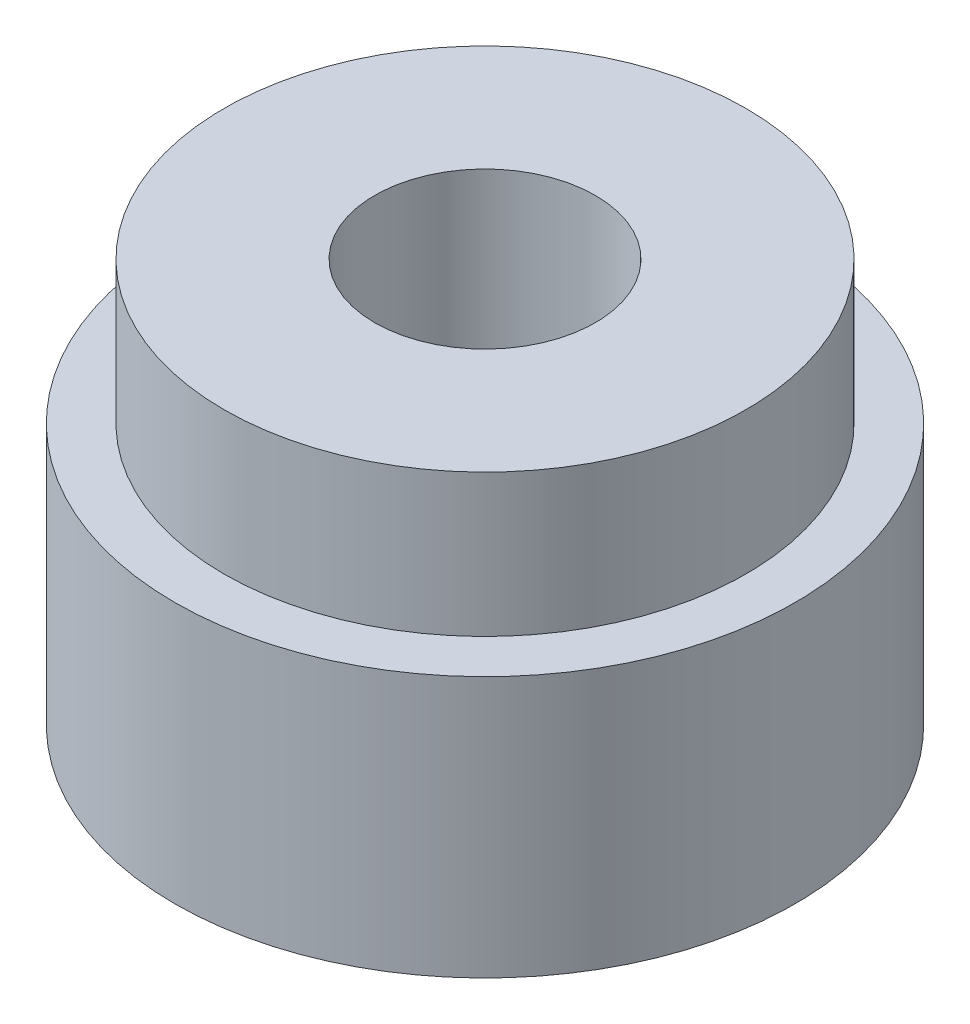
ISO-10303-21;
HEADER;
FILE_DESCRIPTION(('STEP AP214'),'2;1');
FILE_NAME('part.step','',(''),(''),'','','');
FILE_SCHEMA(('AUTOMOTIVE_DESIGN { 1 0 10303 214 1 1 1 1 }'));
ENDSEC;
DATA;
#1=APPLICATION_CONTEXT('core data for automotive mechanical design processes');
#2=APPLICATION_PROTOCOL_DEFINITION('international standard','automotive_design',2000,#1);
#3=PRODUCT_CONTEXT('',#1,'mechanical');
#4=PRODUCT('Part','Part','',(#3));
#5=PRODUCT_RELATED_PRODUCT_CATEGORY('part','',(#4));
#6=PRODUCT_DEFINITION_FORMATION('','',#4);
#7=PRODUCT_DEFINITION_CONTEXT('part definition',#1,'design');
#8=PRODUCT_DEFINITION('design','',#6,#7);
#9=PRODUCT_DEFINITION_SHAPE('','',#8);
#10=(LENGTH_UNIT() NAMED_UNIT(*) SI_UNIT(.MILLI.,.METRE.));
#11=(NAMED_UNIT(*) PLANE_ANGLE_UNIT() SI_UNIT($,.RADIAN.));
#12=(NAMED_UNIT(*) SI_UNIT($,.STERADIAN.) SOLID_ANGLE_UNIT());
#13=UNCERTAINTY_MEASURE_WITH_UNIT(LENGTH_MEASURE(1.E-05),#10,'distance_accuracy_value','');
#14=(GEOMETRIC_REPRESENTATION_CONTEXT(3) GLOBAL_UNCERTAINTY_ASSIGNED_CONTEXT((#13)) GLOBAL_UNIT_ASSIGNED_CONTEXT((#10,
#11,#12)) REPRESENTATION_CONTEXT('',''));
#15=CARTESIAN_POINT('',(0.,0.,0.));
#16=DIRECTION('',(0.,0.,1.));
#17=DIRECTION('',(1.,0.,0.));
#18=AXIS2_PLACEMENT_3D('',#15,#16,#17);
#19=CARTESIAN_POINT('',(0.,17.,0.));
#20=DIRECTION('',(0.,-1.,0.));
#21=DIRECTION('',(0.,0.,-1.));
#22=AXIS2_PLACEMENT_3D('',#19,#20,#21);
#23=CYLINDRICAL_SURFACE('',#22,4.65);
#24=CARTESIAN_POINT('',(0.,17.,0.));
#25=DIRECTION('',(0.,1.,0.));
#26=DIRECTION('',(0.,0.,1.));
#27=AXIS2_PLACEMENT_3D('',#24,#25,#26);
#28=CIRCLE('',#27,4.65);
#29=CARTESIAN_POINT('',(0.,17.,4.65));
#30=VERTEX_POINT('',#29);
#31=EDGE_CURVE('E50',#30,#30,#28,.T.);
#32=ORIENTED_EDGE('',*,*,#31,.T.);
#33=EDGE_LOOP('',(#32));
#34=FACE_BOUND('',#33,.T.);
#35=CARTESIAN_POINT('',(0.,9.15,0.));
#36=DIRECTION('',(0.,-1.,0.));
#37=DIRECTION('',(0.,0.,-1.));
#38=AXIS2_PLACEMENT_3D('',#35,#36,#37);
#39=CIRCLE('',#38,4.65);
#40=CARTESIAN_POINT('',(0.,9.15,-4.65));
#41=VERTEX_POINT('',#40);
#42=EDGE_CURVE('E45',#41,#41,#39,.T.);
#43=ORIENTED_EDGE('',*,*,#42,.T.);
#44=EDGE_LOOP('',(#43));
#45=FACE_BOUND('',#44,.T.);
#46=ADVANCED_FACE('F42',(#34,#45),#23,.F.);
#47=CARTESIAN_POINT('',(0.,17.,0.));
#48=DIRECTION('',(0.,-1.,0.));
#49=DIRECTION('',(0.,0.,-1.));
#50=AXIS2_PLACEMENT_3D('',#47,#48,#49);
#51=CYLINDRICAL_SURFACE('',#50,11.);
#52=CARTESIAN_POINT('',(0.,11.,0.));
#53=DIRECTION('',(0.,1.,0.));
#54=DIRECTION('',(0.,0.,1.));
#55=AXIS2_PLACEMENT_3D('',#52,#53,#54);
#56=CIRCLE('',#55,11.);
#57=CARTESIAN_POINT('',(0.,11.,11.));
#58=VERTEX_POINT('',#57);
#59=EDGE_CURVE('E62',#58,#58,#56,.T.);
#60=ORIENTED_EDGE('',*,*,#59,.T.);
#61=EDGE_LOOP('',(#60));
#62=FACE_BOUND('',#61,.T.);
#63=CARTESIAN_POINT('',(0.,17.,0.));
#64=DIRECTION('',(0.,1.,0.));
#65=DIRECTION('',(0.,0.,1.));
#66=AXIS2_PLACEMENT_3D('',#63,#64,#65);
#67=CIRCLE('',#66,11.);
#68=CARTESIAN_POINT('',(0.,17.,11.));
#69=VERTEX_POINT('',#68);
#70=EDGE_CURVE('E10',#69,#69,#67,.T.);
#71=ORIENTED_EDGE('',*,*,#70,.F.);
#72=EDGE_LOOP('',(#71));
#73=FACE_BOUND('',#72,.T.);
#74=ADVANCED_FACE('F94',(#62,#73),#51,.T.);
#75=CARTESIAN_POINT('',(0.,17.,0.));
#76=DIRECTION('',(0.,1.,0.));
#77=DIRECTION('',(0.,0.,1.));
#78=AXIS2_PLACEMENT_3D('',#75,#76,#77);
#79=PLANE('',#78);
#80=ORIENTED_EDGE('',*,*,#31,.F.);
#81=EDGE_LOOP('',(#80));
#82=FACE_BOUND('',#81,.T.);
#83=ORIENTED_EDGE('',*,*,#70,.T.);
#84=EDGE_LOOP('',(#83));
#85=FACE_BOUND('',#84,.T.);
#86=ADVANCED_FACE('F101',(#82,#85),#79,.T.);
#87=CARTESIAN_POINT('',(0.,0.,0.));
#88=DIRECTION('',(0.,1.,0.));
#89=DIRECTION('',(0.,0.,1.));
#90=AXIS2_PLACEMENT_3D('',#87,#88,#89);
#91=PLANE('',#90);
#92=CARTESIAN_POINT('',(0.,0.,0.));
#93=DIRECTION('',(0.,-1.,0.));
#94=DIRECTION('',(0.,0.,-1.));
#95=AXIS2_PLACEMENT_3D('',#92,#93,#94);
#96=CIRCLE('',#95,9.);
#97=CARTESIAN_POINT('',(0.,0.,-9.));
#98=VERTEX_POINT('',#97);
#99=EDGE_CURVE('E69',#98,#98,#96,.T.);
#100=ORIENTED_EDGE('',*,*,#99,.F.);
#101=EDGE_LOOP('',(#100));
#102=FACE_BOUND('',#101,.T.);
#103=CARTESIAN_POINT('',(0.,0.,0.));
#104=DIRECTION('',(0.,1.,0.));
#105=DIRECTION('',(0.,0.,1.));
#106=AXIS2_PLACEMENT_3D('',#103,#104,#105);
#107=CIRCLE('',#106,13.075);
#108=CARTESIAN_POINT('',(0.,0.,13.075));
#109=VERTEX_POINT('',#108);
#110=EDGE_CURVE('E58',#109,#109,#107,.T.);
#111=ORIENTED_EDGE('',*,*,#110,.F.);
#112=EDGE_LOOP('',(#111));
#113=FACE_BOUND('',#112,.T.);
#114=ADVANCED_FACE('F106',(#102,#113),#91,.F.);
#115=CARTESIAN_POINT('',(0.,11.,0.));
#116=DIRECTION('',(0.,-1.,0.));
#117=DIRECTION('',(0.,0.,-1.));
#118=AXIS2_PLACEMENT_3D('',#115,#116,#117);
#119=CYLINDRICAL_SURFACE('',#118,13.075);
#120=CARTESIAN_POINT('',(0.,11.,0.));
#121=DIRECTION('',(0.,1.,0.));
#122=DIRECTION('',(0.,0.,1.));
#123=AXIS2_PLACEMENT_3D('',#120,#121,#122);
#124=CIRCLE('',#123,13.075);
#125=CARTESIAN_POINT('',(0.,11.,13.075));
#126=VERTEX_POINT('',#125);
#127=EDGE_CURVE('E55',#126,#126,#124,.T.);
#128=ORIENTED_EDGE('',*,*,#127,.F.);
#129=EDGE_LOOP('',(#128));
#130=FACE_BOUND('',#129,.T.);
#131=ORIENTED_EDGE('',*,*,#110,.T.);
#132=EDGE_LOOP('',(#131));
#133=FACE_BOUND('',#132,.T.);
#134=ADVANCED_FACE('F111',(#130,#133),#119,.T.);
#135=CARTESIAN_POINT('',(0.,11.,0.));
#136=DIRECTION('',(0.,1.,0.));
#137=DIRECTION('',(0.,0.,1.));
#138=AXIS2_PLACEMENT_3D('',#135,#136,#137);
#139=PLANE('',#138);
#140=ORIENTED_EDGE('',*,*,#59,.F.);
#141=EDGE_LOOP('',(#140));
#142=FACE_BOUND('',#141,.T.);
#143=ORIENTED_EDGE('',*,*,#127,.T.);
#144=EDGE_LOOP('',(#143));
#145=FACE_BOUND('',#144,.T.);
#146=ADVANCED_FACE('F90',(#142,#145),#139,.T.);
#147=CARTESIAN_POINT('',(0.,9.15,0.));
#148=DIRECTION('',(0.,-1.,0.));
#149=DIRECTION('',(0.,0.,-1.));
#150=AXIS2_PLACEMENT_3D('',#147,#148,#149);
#151=CYLINDRICAL_SURFACE('',#150,9.);
#152=CARTESIAN_POINT('',(0.,9.15,0.));
#153=DIRECTION('',(0.,-1.,0.));
#154=DIRECTION('',(0.,0.,-1.));
#155=AXIS2_PLACEMENT_3D('',#152,#153,#154);
#156=CIRCLE('',#155,9.);
#157=CARTESIAN_POINT('',(0.,9.15,-9.));
#158=VERTEX_POINT('',#157);
#159=EDGE_CURVE('E73',#158,#158,#156,.T.);
#160=ORIENTED_EDGE('',*,*,#159,.F.);
#161=EDGE_LOOP('',(#160));
#162=FACE_BOUND('',#161,.T.);
#163=ORIENTED_EDGE('',*,*,#99,.T.);
#164=EDGE_LOOP('',(#163));
#165=FACE_BOUND('',#164,.T.);
#166=ADVANCED_FACE('F85',(#162,#165),#151,.F.);
#167=CARTESIAN_POINT('',(0.,9.15,0.));
#168=DIRECTION('',(0.,-1.,0.));
#169=DIRECTION('',(0.,0.,-1.));
#170=AXIS2_PLACEMENT_3D('',#167,#168,#169);
#171=PLANE('',#170);
#172=ORIENTED_EDGE('',*,*,#42,.F.);
#173=EDGE_LOOP('',(#172));
#174=FACE_BOUND('',#173,.T.);
#175=ORIENTED_EDGE('',*,*,#159,.T.);
#176=EDGE_LOOP('',(#175));
#177=FACE_BOUND('',#176,.T.);
#178=ADVANCED_FACE('F83',(#174,#177),#171,.T.);
#179=CLOSED_SHELL('',(#46,#74,#86,#114,#134,#146,#166,#178));
#180=MANIFOLD_SOLID_BREP('B2',#179);
#181=ADVANCED_BREP_SHAPE_REPRESENTATION('',(#18,#180),#14);
#182=SHAPE_DEFINITION_REPRESENTATION(#9,#181);
ENDSEC;
END-ISO-10303-21;
